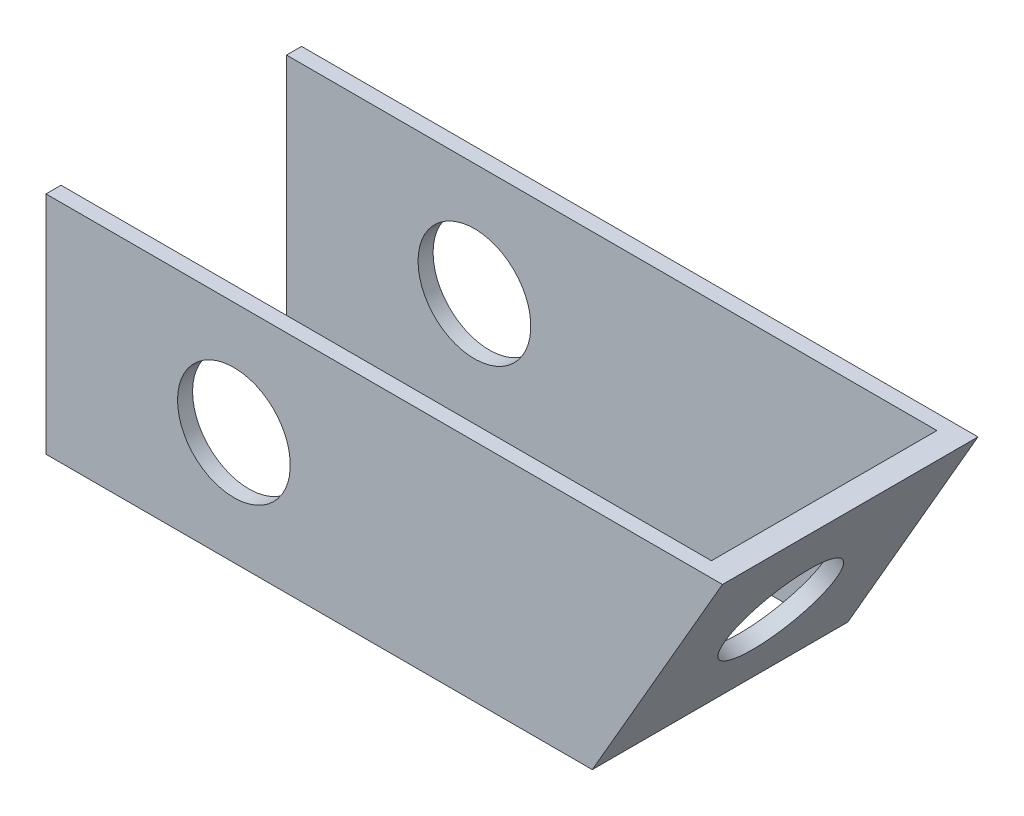
ISO-10303-21;
HEADER;
FILE_DESCRIPTION(('STEP AP214'),'2;1');
FILE_NAME('part.step','',(''),(''),'','','');
FILE_SCHEMA(('AUTOMOTIVE_DESIGN { 1 0 10303 214 1 1 1 1 }'));
ENDSEC;
DATA;
#1=APPLICATION_CONTEXT('core data for automotive mechanical design processes');
#2=APPLICATION_PROTOCOL_DEFINITION('international standard','automotive_design',2000,#1);
#3=PRODUCT_CONTEXT('',#1,'mechanical');
#4=PRODUCT('Part','Part','',(#3));
#5=PRODUCT_RELATED_PRODUCT_CATEGORY('part','',(#4));
#6=PRODUCT_DEFINITION_FORMATION('','',#4);
#7=PRODUCT_DEFINITION_CONTEXT('part definition',#1,'design');
#8=PRODUCT_DEFINITION('design','',#6,#7);
#9=PRODUCT_DEFINITION_SHAPE('','',#8);
#10=(LENGTH_UNIT() NAMED_UNIT(*) SI_UNIT(.MILLI.,.METRE.));
#11=(NAMED_UNIT(*) PLANE_ANGLE_UNIT() SI_UNIT($,.RADIAN.));
#12=(NAMED_UNIT(*) SI_UNIT($,.STERADIAN.) SOLID_ANGLE_UNIT());
#13=UNCERTAINTY_MEASURE_WITH_UNIT(LENGTH_MEASURE(1.E-05),#10,'distance_accuracy_value','');
#14=(GEOMETRIC_REPRESENTATION_CONTEXT(3) GLOBAL_UNCERTAINTY_ASSIGNED_CONTEXT((#13)) GLOBAL_UNIT_ASSIGNED_CONTEXT((#10,
#11,#12)) REPRESENTATION_CONTEXT('',''));
#15=CARTESIAN_POINT('',(0.,0.,0.));
#16=DIRECTION('',(0.,0.,1.));
#17=DIRECTION('',(1.,0.,0.));
#18=AXIS2_PLACEMENT_3D('',#15,#16,#17);
#19=CARTESIAN_POINT('',(-45.,0.,34.));
#20=DIRECTION('',(-1.,0.,0.));
#21=DIRECTION('',(0.,0.,1.));
#22=AXIS2_PLACEMENT_3D('',#19,#20,#21);
#23=PLANE('',#22);
#24=DIRECTION('',(0.,0.,-1.));
#25=VECTOR('',#24,1.);
#26=CARTESIAN_POINT('',(-45.,15.,34.));
#27=LINE('',#26,#25);
#28=CARTESIAN_POINT('',(-45.,15.,34.));
#29=VERTEX_POINT('',#28);
#30=CARTESIAN_POINT('',(-45.,15.,32.));
#31=VERTEX_POINT('',#30);
#32=EDGE_CURVE('E241',#29,#31,#27,.T.);
#33=ORIENTED_EDGE('',*,*,#32,.T.);
#34=DIRECTION('',(0.,1.,0.));
#35=VECTOR('',#34,1.);
#36=CARTESIAN_POINT('',(-45.,0.,32.));
#37=LINE('',#36,#35);
#38=CARTESIAN_POINT('',(-45.,-15.,32.));
#39=VERTEX_POINT('',#38);
#40=EDGE_CURVE('E202',#39,#31,#37,.T.);
#41=ORIENTED_EDGE('',*,*,#40,.F.);
#42=DIRECTION('',(0.,0.,-1.));
#43=VECTOR('',#42,1.);
#44=CARTESIAN_POINT('',(-45.,-15.,34.));
#45=LINE('',#44,#43);
#46=CARTESIAN_POINT('',(-45.,-15.,34.));
#47=VERTEX_POINT('',#46);
#48=EDGE_CURVE('E11',#47,#39,#45,.T.);
#49=ORIENTED_EDGE('',*,*,#48,.F.);
#50=DIRECTION('',(0.,1.,0.));
#51=VECTOR('',#50,1.);
#52=CARTESIAN_POINT('',(-45.,0.,34.));
#53=LINE('',#52,#51);
#54=EDGE_CURVE('E214',#47,#29,#53,.T.);
#55=ORIENTED_EDGE('',*,*,#54,.T.);
#56=EDGE_LOOP('',(#33,#41,#49,#55));
#57=FACE_BOUND('',#56,.T.);
#58=ADVANCED_FACE('F40',(#57),#23,.T.);
#59=CARTESIAN_POINT('',(0.,-15.,34.));
#60=DIRECTION('',(0.,-1.,0.));
#61=DIRECTION('',(1.,0.,0.));
#62=AXIS2_PLACEMENT_3D('',#59,#60,#61);
#63=PLANE('',#62);
#64=DIRECTION('',(1.,0.,0.));
#65=VECTOR('',#64,1.);
#66=CARTESIAN_POINT('',(0.,-15.,32.));
#67=LINE('',#66,#65);
#68=CARTESIAN_POINT('',(26.5247913859321,-15.,32.));
#69=VERTEX_POINT('',#68);
#70=EDGE_CURVE('E138',#39,#69,#67,.T.);
#71=ORIENTED_EDGE('',*,*,#70,.T.);
#72=DIRECTION('',(0.,0.,-1.));
#73=VECTOR('',#72,1.);
#74=CARTESIAN_POINT('',(26.5247913859321,-15.,32.));
#75=LINE('',#74,#73);
#76=CARTESIAN_POINT('',(26.5247913859321,-15.,2.));
#77=VERTEX_POINT('',#76);
#78=EDGE_CURVE('E144',#69,#77,#75,.T.);
#79=ORIENTED_EDGE('',*,*,#78,.T.);
#80=DIRECTION('',(1.,0.,0.));
#81=VECTOR('',#80,1.);
#82=CARTESIAN_POINT('',(0.,-15.,2.));
#83=LINE('',#82,#81);
#84=CARTESIAN_POINT('',(-45.,-15.,2.));
#85=VERTEX_POINT('',#84);
#86=EDGE_CURVE('E126',#85,#77,#83,.T.);
#87=ORIENTED_EDGE('',*,*,#86,.F.);
#88=CARTESIAN_POINT('',(-45.,-15.,0.));
#89=VERTEX_POINT('',#88);
#90=EDGE_CURVE('E51',#85,#89,#45,.T.);
#91=ORIENTED_EDGE('',*,*,#90,.T.);
#92=DIRECTION('',(-1.,0.,0.));
#93=VECTOR('',#92,1.);
#94=CARTESIAN_POINT('',(0.,-15.,0.));
#95=LINE('',#94,#93);
#96=CARTESIAN_POINT('',(27.6794919243113,-15.,0.));
#97=VERTEX_POINT('',#96);
#98=EDGE_CURVE('E231',#97,#89,#95,.T.);
#99=ORIENTED_EDGE('',*,*,#98,.F.);
#100=DIRECTION('',(0.,0.,-1.));
#101=VECTOR('',#100,1.);
#102=CARTESIAN_POINT('',(27.6794919243113,-15.,34.));
#103=LINE('',#102,#101);
#104=CARTESIAN_POINT('',(27.6794919243113,-15.,34.));
#105=VERTEX_POINT('',#104);
#106=EDGE_CURVE('E247',#105,#97,#103,.T.);
#107=ORIENTED_EDGE('',*,*,#106,.F.);
#108=DIRECTION('',(-1.,0.,0.));
#109=VECTOR('',#108,1.);
#110=CARTESIAN_POINT('',(0.,-15.,34.));
#111=LINE('',#110,#109);
#112=EDGE_CURVE('E217',#105,#47,#111,.T.);
#113=ORIENTED_EDGE('',*,*,#112,.T.);
#114=ORIENTED_EDGE('',*,*,#48,.T.);
#115=EDGE_LOOP('',(#71,#79,#87,#91,#99,#107,#113,#114));
#116=FACE_BOUND('',#115,.T.);
#117=ADVANCED_FACE('F151',(#116),#63,.T.);
#118=CARTESIAN_POINT('',(0.,15.,34.));
#119=DIRECTION('',(0.,-1.,0.));
#120=DIRECTION('',(1.,0.,0.));
#121=AXIS2_PLACEMENT_3D('',#118,#119,#120);
#122=PLANE('',#121);
#123=DIRECTION('',(-1.,0.,0.));
#124=VECTOR('',#123,1.);
#125=CARTESIAN_POINT('',(0.,15.,2.));
#126=LINE('',#125,#124);
#127=CARTESIAN_POINT('',(41.5358983848623,15.,2.));
#128=VERTEX_POINT('',#127);
#129=CARTESIAN_POINT('',(-45.,15.,2.));
#130=VERTEX_POINT('',#129);
#131=EDGE_CURVE('E187',#128,#130,#126,.T.);
#132=ORIENTED_EDGE('',*,*,#131,.F.);
#133=DIRECTION('',(0.,0.,1.));
#134=VECTOR('',#133,1.);
#135=CARTESIAN_POINT('',(41.5358983848623,15.,32.));
#136=LINE('',#135,#134);
#137=CARTESIAN_POINT('',(41.5358983848623,15.,32.));
#138=VERTEX_POINT('',#137);
#139=EDGE_CURVE('E164',#128,#138,#136,.T.);
#140=ORIENTED_EDGE('',*,*,#139,.T.);
#141=DIRECTION('',(-1.,0.,0.));
#142=VECTOR('',#141,1.);
#143=CARTESIAN_POINT('',(0.,15.,32.));
#144=LINE('',#143,#142);
#145=EDGE_CURVE('E139',#138,#31,#144,.T.);
#146=ORIENTED_EDGE('',*,*,#145,.T.);
#147=ORIENTED_EDGE('',*,*,#32,.F.);
#148=DIRECTION('',(-1.,0.,0.));
#149=VECTOR('',#148,1.);
#150=CARTESIAN_POINT('',(0.,15.,34.));
#151=LINE('',#150,#149);
#152=CARTESIAN_POINT('',(45.,15.,34.));
#153=VERTEX_POINT('',#152);
#154=EDGE_CURVE('E59',#153,#29,#151,.T.);
#155=ORIENTED_EDGE('',*,*,#154,.F.);
#156=DIRECTION('',(0.,0.,-1.));
#157=VECTOR('',#156,1.);
#158=CARTESIAN_POINT('',(45.,15.,34.));
#159=LINE('',#158,#157);
#160=CARTESIAN_POINT('',(45.,15.,0.));
#161=VERTEX_POINT('',#160);
#162=EDGE_CURVE('E76',#153,#161,#159,.T.);
#163=ORIENTED_EDGE('',*,*,#162,.T.);
#164=DIRECTION('',(-1.,0.,0.));
#165=VECTOR('',#164,1.);
#166=CARTESIAN_POINT('',(0.,15.,0.));
#167=LINE('',#166,#165);
#168=CARTESIAN_POINT('',(-45.,15.,0.));
#169=VERTEX_POINT('',#168);
#170=EDGE_CURVE('E218',#161,#169,#167,.T.);
#171=ORIENTED_EDGE('',*,*,#170,.T.);
#172=EDGE_CURVE('E84',#130,#169,#27,.T.);
#173=ORIENTED_EDGE('',*,*,#172,.F.);
#174=EDGE_LOOP('',(#132,#140,#146,#147,#155,#163,#171,#173));
#175=FACE_BOUND('',#174,.T.);
#176=ADVANCED_FACE('F256',(#175),#122,.F.);
#177=DIRECTION('',(0.,1.,0.));
#178=VECTOR('',#177,1.);
#179=CARTESIAN_POINT('',(-45.,0.,2.));
#180=LINE('',#179,#178);
#181=EDGE_CURVE('E133',#85,#130,#180,.T.);
#182=ORIENTED_EDGE('',*,*,#181,.T.);
#183=ORIENTED_EDGE('',*,*,#172,.T.);
#184=DIRECTION('',(0.,1.,0.));
#185=VECTOR('',#184,1.);
#186=CARTESIAN_POINT('',(-45.,0.,0.));
#187=LINE('',#186,#185);
#188=EDGE_CURVE('E197',#89,#169,#187,.T.);
#189=ORIENTED_EDGE('',*,*,#188,.F.);
#190=ORIENTED_EDGE('',*,*,#90,.F.);
#191=EDGE_LOOP('',(#182,#183,#189,#190));
#192=FACE_BOUND('',#191,.T.);
#193=ADVANCED_FACE('F42',(#192),#23,.T.);
#194=CARTESIAN_POINT('',(27.2548094716168,-15.7355715851498,34.));
#195=DIRECTION('',(0.86602540378444,-0.499999999999998,0.));
#196=DIRECTION('',(0.499999999999998,0.86602540378444,0.));
#197=AXIS2_PLACEMENT_3D('',#194,#195,#196);
#198=PLANE('',#197);
#199=CARTESIAN_POINT('',(35.7623956929661,-0.999999999999989,17.));
#200=DIRECTION('',(-0.86602540378444,0.499999999999998,0.));
#201=DIRECTION('',(-0.499999999999998,-0.86602540378444,0.));
#202=AXIS2_PLACEMENT_3D('',#199,#200,#201);
#203=CIRCLE('',#202,7.5);
#204=CARTESIAN_POINT('',(32.0123956929661,-7.49519052838329,17.));
#205=VERTEX_POINT('',#204);
#206=EDGE_CURVE('E155',#205,#205,#203,.T.);
#207=ORIENTED_EDGE('',*,*,#206,.T.);
#208=EDGE_LOOP('',(#207));
#209=FACE_BOUND('',#208,.T.);
#210=DIRECTION('',(-0.499999999999998,-0.86602540378444,0.));
#211=VECTOR('',#210,1.);
#212=CARTESIAN_POINT('',(27.2548094716168,-15.7355715851498,0.));
#213=LINE('',#212,#211);
#214=EDGE_CURVE('E235',#161,#97,#213,.T.);
#215=ORIENTED_EDGE('',*,*,#214,.F.);
#216=ORIENTED_EDGE('',*,*,#162,.F.);
#217=DIRECTION('',(-0.499999999999998,-0.86602540378444,0.));
#218=VECTOR('',#217,1.);
#219=CARTESIAN_POINT('',(27.2548094716168,-15.7355715851498,34.));
#220=LINE('',#219,#218);
#221=EDGE_CURVE('E222',#153,#105,#220,.T.);
#222=ORIENTED_EDGE('',*,*,#221,.T.);
#223=ORIENTED_EDGE('',*,*,#106,.T.);
#224=EDGE_LOOP('',(#215,#216,#222,#223));
#225=FACE_BOUND('',#224,.T.);
#226=ADVANCED_FACE('F255',(#209,#225),#198,.T.);
#227=CARTESIAN_POINT('',(0.,0.,34.));
#228=DIRECTION('',(0.,0.,1.));
#229=DIRECTION('',(1.,0.,0.));
#230=AXIS2_PLACEMENT_3D('',#227,#228,#229);
#231=PLANE('',#230);
#232=CARTESIAN_POINT('',(-20.,0.,34.));
#233=DIRECTION('',(0.,0.,1.));
#234=DIRECTION('',(1.,0.,0.));
#235=AXIS2_PLACEMENT_3D('',#232,#233,#234);
#236=CIRCLE('',#235,7.5);
#237=CARTESIAN_POINT('',(-27.5,0.,34.));
#238=VERTEX_POINT('',#237);
#239=EDGE_CURVE('E183',#238,#238,#236,.T.);
#240=ORIENTED_EDGE('',*,*,#239,.F.);
#241=EDGE_LOOP('',(#240));
#242=FACE_BOUND('',#241,.T.);
#243=ORIENTED_EDGE('',*,*,#54,.F.);
#244=ORIENTED_EDGE('',*,*,#112,.F.);
#245=ORIENTED_EDGE('',*,*,#221,.F.);
#246=ORIENTED_EDGE('',*,*,#154,.T.);
#247=EDGE_LOOP('',(#243,#244,#245,#246));
#248=FACE_BOUND('',#247,.T.);
#249=ADVANCED_FACE('F258',(#242,#248),#231,.T.);
#250=CARTESIAN_POINT('',(0.,0.,0.));
#251=DIRECTION('',(0.,0.,1.));
#252=DIRECTION('',(1.,0.,0.));
#253=AXIS2_PLACEMENT_3D('',#250,#251,#252);
#254=PLANE('',#253);
#255=CARTESIAN_POINT('',(-20.,0.,0.));
#256=DIRECTION('',(0.,0.,-1.));
#257=DIRECTION('',(-1.,0.,0.));
#258=AXIS2_PLACEMENT_3D('',#255,#256,#257);
#259=CIRCLE('',#258,7.5);
#260=CARTESIAN_POINT('',(-27.5,0.,0.));
#261=VERTEX_POINT('',#260);
#262=EDGE_CURVE('E173',#261,#261,#259,.T.);
#263=ORIENTED_EDGE('',*,*,#262,.F.);
#264=EDGE_LOOP('',(#263));
#265=FACE_BOUND('',#264,.T.);
#266=ORIENTED_EDGE('',*,*,#188,.T.);
#267=ORIENTED_EDGE('',*,*,#170,.F.);
#268=ORIENTED_EDGE('',*,*,#214,.T.);
#269=ORIENTED_EDGE('',*,*,#98,.T.);
#270=EDGE_LOOP('',(#266,#267,#268,#269));
#271=FACE_BOUND('',#270,.T.);
#272=ADVANCED_FACE('F254',(#265,#271),#254,.F.);
#273=CARTESIAN_POINT('',(25.522758664048,-14.7355715851499,34.));
#274=DIRECTION('',(0.86602540378444,-0.499999999999998,0.));
#275=DIRECTION('',(0.499999999999998,0.86602540378444,0.));
#276=AXIS2_PLACEMENT_3D('',#273,#274,#275);
#277=PLANE('',#276);
#278=CARTESIAN_POINT('',(34.0303448853972,0.,17.));
#279=DIRECTION('',(-0.86602540378444,0.499999999999998,0.));
#280=DIRECTION('',(-0.499999999999998,-0.86602540378444,0.));
#281=AXIS2_PLACEMENT_3D('',#278,#279,#280);
#282=CIRCLE('',#281,7.5);
#283=CARTESIAN_POINT('',(30.2803448853972,-6.49519052838329,17.));
#284=VERTEX_POINT('',#283);
#285=EDGE_CURVE('E159',#284,#284,#282,.T.);
#286=ORIENTED_EDGE('',*,*,#285,.F.);
#287=EDGE_LOOP('',(#286));
#288=FACE_BOUND('',#287,.T.);
#289=DIRECTION('',(-0.499999999999998,-0.86602540378444,0.));
#290=VECTOR('',#289,1.);
#291=CARTESIAN_POINT('',(25.522758664048,-14.7355715851499,2.));
#292=LINE('',#291,#290);
#293=CARTESIAN_POINT('',(41.5358983848623,13.,2.));
#294=VERTEX_POINT('',#293);
#295=CARTESIAN_POINT('',(26.5247913859321,-13.,2.));
#296=VERTEX_POINT('',#295);
#297=EDGE_CURVE('E199',#294,#296,#292,.T.);
#298=ORIENTED_EDGE('',*,*,#297,.T.);
#299=DIRECTION('',(0.,0.,-1.));
#300=VECTOR('',#299,1.);
#301=CARTESIAN_POINT('',(26.5247913859321,-13.,34.));
#302=LINE('',#301,#300);
#303=CARTESIAN_POINT('',(26.5247913859321,-13.,32.));
#304=VERTEX_POINT('',#303);
#305=EDGE_CURVE('E146',#304,#296,#302,.T.);
#306=ORIENTED_EDGE('',*,*,#305,.F.);
#307=DIRECTION('',(-0.499999999999998,-0.86602540378444,0.));
#308=VECTOR('',#307,1.);
#309=CARTESIAN_POINT('',(25.522758664048,-14.7355715851499,32.));
#310=LINE('',#309,#308);
#311=CARTESIAN_POINT('',(41.5358983848623,13.,32.));
#312=VERTEX_POINT('',#311);
#313=EDGE_CURVE('E206',#312,#304,#310,.T.);
#314=ORIENTED_EDGE('',*,*,#313,.F.);
#315=DIRECTION('',(0.,0.,-1.));
#316=VECTOR('',#315,1.);
#317=CARTESIAN_POINT('',(41.5358983848623,13.,34.));
#318=LINE('',#317,#316);
#319=EDGE_CURVE('E198',#312,#294,#318,.T.);
#320=ORIENTED_EDGE('',*,*,#319,.T.);
#321=EDGE_LOOP('',(#298,#306,#314,#320));
#322=FACE_BOUND('',#321,.T.);
#323=ADVANCED_FACE('F263',(#288,#322),#277,.F.);
#324=CARTESIAN_POINT('',(0.,0.,32.));
#325=DIRECTION('',(0.,0.,1.));
#326=DIRECTION('',(1.,0.,0.));
#327=AXIS2_PLACEMENT_3D('',#324,#325,#326);
#328=PLANE('',#327);
#329=CARTESIAN_POINT('',(-20.,0.,32.));
#330=DIRECTION('',(0.,0.,1.));
#331=DIRECTION('',(1.,0.,0.));
#332=AXIS2_PLACEMENT_3D('',#329,#330,#331);
#333=CIRCLE('',#332,7.5);
#334=CARTESIAN_POINT('',(-27.5,0.,32.));
#335=VERTEX_POINT('',#334);
#336=EDGE_CURVE('E179',#335,#335,#333,.T.);
#337=ORIENTED_EDGE('',*,*,#336,.T.);
#338=EDGE_LOOP('',(#337));
#339=FACE_BOUND('',#338,.T.);
#340=ORIENTED_EDGE('',*,*,#313,.T.);
#341=DIRECTION('',(0.,1.,0.));
#342=VECTOR('',#341,1.);
#343=CARTESIAN_POINT('',(26.5247913859321,-15.,32.));
#344=LINE('',#343,#342);
#345=EDGE_CURVE('E149',#69,#304,#344,.T.);
#346=ORIENTED_EDGE('',*,*,#345,.F.);
#347=ORIENTED_EDGE('',*,*,#70,.F.);
#348=ORIENTED_EDGE('',*,*,#40,.T.);
#349=ORIENTED_EDGE('',*,*,#145,.F.);
#350=DIRECTION('',(0.,-1.,0.));
#351=VECTOR('',#350,1.);
#352=CARTESIAN_POINT('',(41.5358983848623,15.,32.));
#353=LINE('',#352,#351);
#354=EDGE_CURVE('E169',#138,#312,#353,.T.);
#355=ORIENTED_EDGE('',*,*,#354,.T.);
#356=EDGE_LOOP('',(#340,#346,#347,#348,#349,#355));
#357=FACE_BOUND('',#356,.T.);
#358=ADVANCED_FACE('F260',(#339,#357),#328,.F.);
#359=CARTESIAN_POINT('',(0.,0.,2.));
#360=DIRECTION('',(0.,0.,1.));
#361=DIRECTION('',(1.,0.,0.));
#362=AXIS2_PLACEMENT_3D('',#359,#360,#361);
#363=PLANE('',#362);
#364=CARTESIAN_POINT('',(-20.,0.,2.));
#365=DIRECTION('',(0.,0.,1.));
#366=DIRECTION('',(1.,0.,0.));
#367=AXIS2_PLACEMENT_3D('',#364,#365,#366);
#368=CIRCLE('',#367,7.5);
#369=CARTESIAN_POINT('',(-27.5,0.,2.));
#370=VERTEX_POINT('',#369);
#371=EDGE_CURVE('E44',#370,#370,#368,.T.);
#372=ORIENTED_EDGE('',*,*,#371,.F.);
#373=EDGE_LOOP('',(#372));
#374=FACE_BOUND('',#373,.T.);
#375=ORIENTED_EDGE('',*,*,#297,.F.);
#376=DIRECTION('',(0.,-1.,0.));
#377=VECTOR('',#376,1.);
#378=CARTESIAN_POINT('',(41.5358983848623,15.,2.));
#379=LINE('',#378,#377);
#380=EDGE_CURVE('E170',#128,#294,#379,.T.);
#381=ORIENTED_EDGE('',*,*,#380,.F.);
#382=ORIENTED_EDGE('',*,*,#131,.T.);
#383=ORIENTED_EDGE('',*,*,#181,.F.);
#384=ORIENTED_EDGE('',*,*,#86,.T.);
#385=DIRECTION('',(0.,1.,0.));
#386=VECTOR('',#385,1.);
#387=CARTESIAN_POINT('',(26.5247913859321,-15.,2.));
#388=LINE('',#387,#386);
#389=EDGE_CURVE('E130',#77,#296,#388,.T.);
#390=ORIENTED_EDGE('',*,*,#389,.T.);
#391=EDGE_LOOP('',(#375,#381,#382,#383,#384,#390));
#392=FACE_BOUND('',#391,.T.);
#393=ADVANCED_FACE('F129',(#374,#392),#363,.T.);
#394=CARTESIAN_POINT('',(-20.,0.,50.));
#395=DIRECTION('',(0.,0.,-1.));
#396=DIRECTION('',(-1.,0.,0.));
#397=AXIS2_PLACEMENT_3D('',#394,#395,#396);
#398=CYLINDRICAL_SURFACE('',#397,7.5);
#399=CARTESIAN_POINT('',(-27.5,0.,2.));
#400=CARTESIAN_POINT('',(-27.5,0.,1.97916666666667));
#401=CARTESIAN_POINT('',(-27.5,0.,1.95833333333334));
#402=CARTESIAN_POINT('',(-27.5,0.,1.91666666666667));
#403=CARTESIAN_POINT('',(-27.5,0.,1.89583333333334));
#404=CARTESIAN_POINT('',(-27.5,0.,1.85416666666667));
#405=CARTESIAN_POINT('',(-27.5,0.,1.83333333333334));
#406=CARTESIAN_POINT('',(-27.5,0.,1.79166666666667));
#407=CARTESIAN_POINT('',(-27.5,0.,1.77083333333334));
#408=CARTESIAN_POINT('',(-27.5,0.,1.72916666666667));
#409=CARTESIAN_POINT('',(-27.5,0.,1.70833333333333));
#410=CARTESIAN_POINT('',(-27.5,0.,1.66666666666667));
#411=CARTESIAN_POINT('',(-27.5,0.,1.64583333333333));
#412=CARTESIAN_POINT('',(-27.5,0.,1.60416666666667));
#413=CARTESIAN_POINT('',(-27.5,0.,1.58333333333333));
#414=CARTESIAN_POINT('',(-27.5,0.,1.54166666666667));
#415=CARTESIAN_POINT('',(-27.5,0.,1.52083333333333));
#416=CARTESIAN_POINT('',(-27.5,0.,1.47916666666667));
#417=CARTESIAN_POINT('',(-27.5,0.,1.45833333333333));
#418=CARTESIAN_POINT('',(-27.5,0.,1.41666666666667));
#419=CARTESIAN_POINT('',(-27.5,0.,1.39583333333333));
#420=CARTESIAN_POINT('',(-27.5,0.,1.35416666666667));
#421=CARTESIAN_POINT('',(-27.5,0.,1.33333333333333));
#422=CARTESIAN_POINT('',(-27.5,0.,1.29166666666667));
#423=CARTESIAN_POINT('',(-27.5,0.,1.27083333333333));
#424=CARTESIAN_POINT('',(-27.5,0.,1.22916666666667));
#425=CARTESIAN_POINT('',(-27.5,0.,1.20833333333333));
#426=CARTESIAN_POINT('',(-27.5,0.,1.16666666666667));
#427=CARTESIAN_POINT('',(-27.5,0.,1.14583333333333));
#428=CARTESIAN_POINT('',(-27.5,0.,1.10416666666667));
#429=CARTESIAN_POINT('',(-27.5,0.,1.08333333333333));
#430=CARTESIAN_POINT('',(-27.5,0.,1.04166666666667));
#431=CARTESIAN_POINT('',(-27.5,0.,1.02083333333333));
#432=CARTESIAN_POINT('',(-27.5,0.,0.979166666666668));
#433=CARTESIAN_POINT('',(-27.5,0.,0.958333333333334));
#434=CARTESIAN_POINT('',(-27.5,0.,0.916666666666668));
#435=CARTESIAN_POINT('',(-27.5,0.,0.895833333333334));
#436=CARTESIAN_POINT('',(-27.5,0.,0.854166666666667));
#437=CARTESIAN_POINT('',(-27.5,0.,0.833333333333334));
#438=CARTESIAN_POINT('',(-27.5,0.,0.791666666666667));
#439=CARTESIAN_POINT('',(-27.5,0.,0.770833333333334));
#440=CARTESIAN_POINT('',(-27.5,0.,0.729166666666667));
#441=CARTESIAN_POINT('',(-27.5,0.,0.708333333333334));
#442=CARTESIAN_POINT('',(-27.5,0.,0.666666666666667));
#443=CARTESIAN_POINT('',(-27.5,0.,0.645833333333334));
#444=CARTESIAN_POINT('',(-27.5,0.,0.604166666666667));
#445=CARTESIAN_POINT('',(-27.5,0.,0.583333333333334));
#446=CARTESIAN_POINT('',(-27.5,0.,0.541666666666667));
#447=CARTESIAN_POINT('',(-27.5,0.,0.520833333333334));
#448=CARTESIAN_POINT('',(-27.5,0.,0.479166666666667));
#449=CARTESIAN_POINT('',(-27.5,0.,0.458333333333334));
#450=CARTESIAN_POINT('',(-27.5,0.,0.416666666666667));
#451=CARTESIAN_POINT('',(-27.5,0.,0.395833333333334));
#452=CARTESIAN_POINT('',(-27.5,0.,0.354166666666667));
#453=CARTESIAN_POINT('',(-27.5,0.,0.333333333333334));
#454=CARTESIAN_POINT('',(-27.5,0.,0.291666666666667));
#455=CARTESIAN_POINT('',(-27.5,0.,0.270833333333334));
#456=CARTESIAN_POINT('',(-27.5,0.,0.229166666666667));
#457=CARTESIAN_POINT('',(-27.5,0.,0.208333333333334));
#458=CARTESIAN_POINT('',(-27.5,0.,0.166666666666667));
#459=CARTESIAN_POINT('',(-27.5,0.,0.145833333333333));
#460=CARTESIAN_POINT('',(-27.5,0.,0.104166666666667));
#461=CARTESIAN_POINT('',(-27.5,0.,0.0833333333333334));
#462=CARTESIAN_POINT('',(-27.5,0.,0.0416666666666667));
#463=CARTESIAN_POINT('',(-27.5,0.,0.0208333333333333));
#464=CARTESIAN_POINT('',(-27.5,0.,0.));
#465=B_SPLINE_CURVE_WITH_KNOTS('',3,(#399,#400,#401,#402,#403,#404,#405,#406,#407,#408,#409,
#410,#411,#412,#413,#414,#415,#416,#417,#418,#419,#420,#421,#422,#423,#424,#425,#426,#427,#428,
#429,#430,#431,#432,#433,#434,#435,#436,#437,#438,#439,#440,#441,#442,#443,#444,#445,#446,#447,
#448,#449,#450,#451,#452,#453,#454,#455,#456,#457,#458,#459,#460,#461,#462,#463,#464),
.UNSPECIFIED.,.F.,.F.,(4,2,2,2,2,2,2,2,2,2,2,2,2,2,2,2,2,2,2,2,2,2,2,2,2,2,2,2,2,2,2,2,4),(0.,
0.0625000000000001,0.125,0.1875,0.25,0.3125,0.375,0.4375,0.5,0.5625,0.625000000000001,
0.687500000000001,0.750000000000001,0.812500000000001,0.875000000000001,0.937500000000001,1.,
1.0625,1.125,1.1875,1.25,1.3125,1.375,1.4375,1.5,1.5625,1.625,1.6875,1.75,1.8125,1.875,1.9375,
2.),.UNSPECIFIED.);
#466=EDGE_CURVE('BSEAM275',#370,#261,#465,.T.);
#467=ORIENTED_EDGE('',*,*,#371,.T.);
#468=ORIENTED_EDGE('',*,*,#262,.T.);
#469=ORIENTED_EDGE('',*,*,#466,.T.);
#470=ORIENTED_EDGE('',*,*,#466,.F.);
#471=EDGE_LOOP('',(#467,#469,#468,#470));
#472=FACE_BOUND('',#471,.T.);
#473=ADVANCED_FACE('F275',(#472),#398,.F.);
#474=CARTESIAN_POINT('',(-27.5,0.,34.));
#475=CARTESIAN_POINT('',(-27.5,0.,33.9791666666667));
#476=CARTESIAN_POINT('',(-27.5,0.,33.9583333333333));
#477=CARTESIAN_POINT('',(-27.5,0.,33.9166666666667));
#478=CARTESIAN_POINT('',(-27.5,0.,33.8958333333333));
#479=CARTESIAN_POINT('',(-27.5,0.,33.8541666666667));
#480=CARTESIAN_POINT('',(-27.5,0.,33.8333333333333));
#481=CARTESIAN_POINT('',(-27.5,0.,33.7916666666667));
#482=CARTESIAN_POINT('',(-27.5,0.,33.7708333333333));
#483=CARTESIAN_POINT('',(-27.5,0.,33.7291666666667));
#484=CARTESIAN_POINT('',(-27.5,0.,33.7083333333333));
#485=CARTESIAN_POINT('',(-27.5,0.,33.6666666666667));
#486=CARTESIAN_POINT('',(-27.5,0.,33.6458333333333));
#487=CARTESIAN_POINT('',(-27.5,0.,33.6041666666667));
#488=CARTESIAN_POINT('',(-27.5,0.,33.5833333333333));
#489=CARTESIAN_POINT('',(-27.5,0.,33.5416666666667));
#490=CARTESIAN_POINT('',(-27.5,0.,33.5208333333333));
#491=CARTESIAN_POINT('',(-27.5,0.,33.4791666666667));
#492=CARTESIAN_POINT('',(-27.5,0.,33.4583333333333));
#493=CARTESIAN_POINT('',(-27.5,0.,33.4166666666667));
#494=CARTESIAN_POINT('',(-27.5,0.,33.3958333333333));
#495=CARTESIAN_POINT('',(-27.5,0.,33.3541666666667));
#496=CARTESIAN_POINT('',(-27.5,0.,33.3333333333333));
#497=CARTESIAN_POINT('',(-27.5,0.,33.2916666666667));
#498=CARTESIAN_POINT('',(-27.5,0.,33.2708333333333));
#499=CARTESIAN_POINT('',(-27.5,0.,33.2291666666667));
#500=CARTESIAN_POINT('',(-27.5,0.,33.2083333333333));
#501=CARTESIAN_POINT('',(-27.5,0.,33.1666666666667));
#502=CARTESIAN_POINT('',(-27.5,0.,33.1458333333333));
#503=CARTESIAN_POINT('',(-27.5,0.,33.1041666666667));
#504=CARTESIAN_POINT('',(-27.5,0.,33.0833333333333));
#505=CARTESIAN_POINT('',(-27.5,0.,33.0416666666667));
#506=CARTESIAN_POINT('',(-27.5,0.,33.0208333333333));
#507=CARTESIAN_POINT('',(-27.5,0.,32.9791666666667));
#508=CARTESIAN_POINT('',(-27.5,0.,32.9583333333333));
#509=CARTESIAN_POINT('',(-27.5,0.,32.9166666666667));
#510=CARTESIAN_POINT('',(-27.5,0.,32.8958333333333));
#511=CARTESIAN_POINT('',(-27.5,0.,32.8541666666667));
#512=CARTESIAN_POINT('',(-27.5,0.,32.8333333333333));
#513=CARTESIAN_POINT('',(-27.5,0.,32.7916666666667));
#514=CARTESIAN_POINT('',(-27.5,0.,32.7708333333333));
#515=CARTESIAN_POINT('',(-27.5,0.,32.7291666666667));
#516=CARTESIAN_POINT('',(-27.5,0.,32.7083333333333));
#517=CARTESIAN_POINT('',(-27.5,0.,32.6666666666667));
#518=CARTESIAN_POINT('',(-27.5,0.,32.6458333333333));
#519=CARTESIAN_POINT('',(-27.5,0.,32.6041666666667));
#520=CARTESIAN_POINT('',(-27.5,0.,32.5833333333333));
#521=CARTESIAN_POINT('',(-27.5,0.,32.5416666666667));
#522=CARTESIAN_POINT('',(-27.5,0.,32.5208333333333));
#523=CARTESIAN_POINT('',(-27.5,0.,32.4791666666667));
#524=CARTESIAN_POINT('',(-27.5,0.,32.4583333333333));
#525=CARTESIAN_POINT('',(-27.5,0.,32.4166666666667));
#526=CARTESIAN_POINT('',(-27.5,0.,32.3958333333333));
#527=CARTESIAN_POINT('',(-27.5,0.,32.3541666666667));
#528=CARTESIAN_POINT('',(-27.5,0.,32.3333333333333));
#529=CARTESIAN_POINT('',(-27.5,0.,32.2916666666667));
#530=CARTESIAN_POINT('',(-27.5,0.,32.2708333333333));
#531=CARTESIAN_POINT('',(-27.5,0.,32.2291666666667));
#532=CARTESIAN_POINT('',(-27.5,0.,32.2083333333333));
#533=CARTESIAN_POINT('',(-27.5,0.,32.1666666666667));
#534=CARTESIAN_POINT('',(-27.5,0.,32.1458333333333));
#535=CARTESIAN_POINT('',(-27.5,0.,32.1041666666667));
#536=CARTESIAN_POINT('',(-27.5,0.,32.0833333333333));
#537=CARTESIAN_POINT('',(-27.5,0.,32.0416666666667));
#538=CARTESIAN_POINT('',(-27.5,0.,32.0208333333333));
#539=CARTESIAN_POINT('',(-27.5,0.,32.));
#540=B_SPLINE_CURVE_WITH_KNOTS('',3,(#474,#475,#476,#477,#478,#479,#480,#481,#482,#483,#484,
#485,#486,#487,#488,#489,#490,#491,#492,#493,#494,#495,#496,#497,#498,#499,#500,#501,#502,#503,
#504,#505,#506,#507,#508,#509,#510,#511,#512,#513,#514,#515,#516,#517,#518,#519,#520,#521,#522,
#523,#524,#525,#526,#527,#528,#529,#530,#531,#532,#533,#534,#535,#536,#537,#538,#539),
.UNSPECIFIED.,.F.,.F.,(4,2,2,2,2,2,2,2,2,2,2,2,2,2,2,2,2,2,2,2,2,2,2,2,2,2,2,2,2,2,2,2,4),(0.,
0.062500000000007,0.125,0.187500000000007,0.25,0.312500000000007,0.375,0.437500000000007,0.5,
0.562500000000007,0.625000000000001,0.687500000000008,0.750000000000001,0.812500000000008,
0.875000000000001,0.937500000000008,1.,1.06250000000001,1.125,1.18750000000001,1.25,
1.31250000000001,1.375,1.43750000000001,1.5,1.56250000000001,1.625,1.68750000000001,1.75,
1.81250000000001,1.875,1.93750000000001,2.),.UNSPECIFIED.);
#541=EDGE_CURVE('BSEAM284',#238,#335,#540,.T.);
#542=ORIENTED_EDGE('',*,*,#239,.T.);
#543=ORIENTED_EDGE('',*,*,#336,.F.);
#544=ORIENTED_EDGE('',*,*,#541,.T.);
#545=ORIENTED_EDGE('',*,*,#541,.F.);
#546=EDGE_LOOP('',(#542,#544,#543,#545));
#547=FACE_BOUND('',#546,.T.);
#548=ADVANCED_FACE('F284',(#547),#398,.F.);
#549=CARTESIAN_POINT('',(41.5358983848623,15.,32.));
#550=DIRECTION('',(1.,0.,0.));
#551=DIRECTION('',(0.,1.,0.));
#552=AXIS2_PLACEMENT_3D('',#549,#550,#551);
#553=PLANE('',#552);
#554=ORIENTED_EDGE('',*,*,#319,.F.);
#555=ORIENTED_EDGE('',*,*,#354,.F.);
#556=ORIENTED_EDGE('',*,*,#139,.F.);
#557=ORIENTED_EDGE('',*,*,#380,.T.);
#558=EDGE_LOOP('',(#554,#555,#556,#557));
#559=FACE_BOUND('',#558,.T.);
#560=ADVANCED_FACE('F269',(#559),#553,.F.);
#561=CARTESIAN_POINT('',(26.5247913859321,-15.,32.));
#562=DIRECTION('',(1.,0.,0.));
#563=DIRECTION('',(0.,1.,0.));
#564=AXIS2_PLACEMENT_3D('',#561,#562,#563);
#565=PLANE('',#564);
#566=ORIENTED_EDGE('',*,*,#305,.T.);
#567=ORIENTED_EDGE('',*,*,#389,.F.);
#568=ORIENTED_EDGE('',*,*,#78,.F.);
#569=ORIENTED_EDGE('',*,*,#345,.T.);
#570=EDGE_LOOP('',(#566,#567,#568,#569));
#571=FACE_BOUND('',#570,.T.);
#572=ADVANCED_FACE('F143',(#571),#565,.F.);
#573=CARTESIAN_POINT('',(35.7623956929661,-0.999999999999989,17.));
#574=DIRECTION('',(-0.86602540378444,0.499999999999998,0.));
#575=DIRECTION('',(-0.499999999999998,-0.86602540378444,0.));
#576=AXIS2_PLACEMENT_3D('',#573,#574,#575);
#577=CYLINDRICAL_SURFACE('',#576,7.5);
#578=CARTESIAN_POINT('',(32.0123956929661,-7.49519052838329,17.));
#579=CARTESIAN_POINT('',(31.9943534970539,-7.48477386171662,17.));
#580=CARTESIAN_POINT('',(31.9763113011417,-7.47435719504996,17.));
#581=CARTESIAN_POINT('',(31.9402269093174,-7.45352386171662,17.));
#582=CARTESIAN_POINT('',(31.9221847134052,-7.44310719504996,17.));
#583=CARTESIAN_POINT('',(31.8861003215808,-7.42227386171662,17.));
#584=CARTESIAN_POINT('',(31.8680581256687,-7.41185719504996,17.));
#585=CARTESIAN_POINT('',(31.8319737338443,-7.39102386171662,17.));
#586=CARTESIAN_POINT('',(31.8139315379321,-7.38060719504996,17.));
#587=CARTESIAN_POINT('',(31.7778471461078,-7.35977386171662,17.));
#588=CARTESIAN_POINT('',(31.7598049501956,-7.34935719504996,17.));
#589=CARTESIAN_POINT('',(31.7237205583713,-7.32852386171662,17.));
#590=CARTESIAN_POINT('',(31.7056783624591,-7.31810719504996,17.));
#591=CARTESIAN_POINT('',(31.6695939706347,-7.29727386171662,17.));
#592=CARTESIAN_POINT('',(31.6515517747226,-7.28685719504996,17.));
#593=CARTESIAN_POINT('',(31.6154673828982,-7.26602386171662,17.));
#594=CARTESIAN_POINT('',(31.597425186986,-7.25560719504996,17.));
#595=CARTESIAN_POINT('',(31.5613407951617,-7.23477386171662,17.));
#596=CARTESIAN_POINT('',(31.5432985992495,-7.22435719504996,17.));
#597=CARTESIAN_POINT('',(31.5072142074252,-7.20352386171662,17.));
#598=CARTESIAN_POINT('',(31.489172011513,-7.19310719504996,17.));
#599=CARTESIAN_POINT('',(31.4530876196886,-7.17227386171662,17.));
#600=CARTESIAN_POINT('',(31.4350454237765,-7.16185719504996,17.));
#601=CARTESIAN_POINT('',(31.3989610319521,-7.14102386171662,17.));
#602=CARTESIAN_POINT('',(31.3809188360399,-7.13060719504996,17.));
#603=CARTESIAN_POINT('',(31.3448344442156,-7.10977386171662,17.));
#604=CARTESIAN_POINT('',(31.3267922483034,-7.09935719504996,17.));
#605=CARTESIAN_POINT('',(31.290707856479,-7.07852386171662,17.));
#606=CARTESIAN_POINT('',(31.2726656605669,-7.06810719504996,17.));
#607=CARTESIAN_POINT('',(31.2365812687425,-7.04727386171662,17.));
#608=CARTESIAN_POINT('',(31.2185390728303,-7.03685719504996,17.));
#609=CARTESIAN_POINT('',(31.182454681006,-7.01602386171662,17.));
#610=CARTESIAN_POINT('',(31.1644124850938,-7.00560719504996,17.));
#611=CARTESIAN_POINT('',(31.1283280932695,-6.98477386171662,17.));
#612=CARTESIAN_POINT('',(31.1102858973573,-6.97435719504996,17.));
#613=CARTESIAN_POINT('',(31.0742015055329,-6.95352386171662,17.));
#614=CARTESIAN_POINT('',(31.0561593096208,-6.94310719504996,17.));
#615=CARTESIAN_POINT('',(31.0200749177964,-6.92227386171662,17.));
#616=CARTESIAN_POINT('',(31.0020327218842,-6.91185719504996,17.));
#617=CARTESIAN_POINT('',(30.9659483300599,-6.89102386171662,17.));
#618=CARTESIAN_POINT('',(30.9479061341477,-6.88060719504996,17.));
#619=CARTESIAN_POINT('',(30.9118217423234,-6.85977386171662,17.));
#620=CARTESIAN_POINT('',(30.8937795464112,-6.84935719504996,17.));
#621=CARTESIAN_POINT('',(30.8576951545868,-6.82852386171662,17.));
#622=CARTESIAN_POINT('',(30.8396529586746,-6.81810719504996,17.));
#623=CARTESIAN_POINT('',(30.8035685668503,-6.79727386171663,17.));
#624=CARTESIAN_POINT('',(30.7855263709381,-6.78685719504996,17.));
#625=CARTESIAN_POINT('',(30.7494419791138,-6.76602386171663,17.));
#626=CARTESIAN_POINT('',(30.7313997832016,-6.75560719504996,17.));
#627=CARTESIAN_POINT('',(30.6953153913772,-6.73477386171663,17.));
#628=CARTESIAN_POINT('',(30.6772731954651,-6.72435719504996,17.));
#629=CARTESIAN_POINT('',(30.6411888036407,-6.70352386171663,17.));
#630=CARTESIAN_POINT('',(30.6231466077285,-6.69310719504996,17.));
#631=CARTESIAN_POINT('',(30.5870622159042,-6.67227386171663,17.));
#632=CARTESIAN_POINT('',(30.569020019992,-6.66185719504996,17.));
#633=CARTESIAN_POINT('',(30.5329356281677,-6.64102386171663,17.));
#634=CARTESIAN_POINT('',(30.5148934322555,-6.63060719504996,17.));
#635=CARTESIAN_POINT('',(30.4788090404311,-6.60977386171663,17.));
#636=CARTESIAN_POINT('',(30.460766844519,-6.59935719504996,17.));
#637=CARTESIAN_POINT('',(30.4246824526946,-6.57852386171663,17.));
#638=CARTESIAN_POINT('',(30.4066402567824,-6.56810719504996,17.));
#639=CARTESIAN_POINT('',(30.3705558649581,-6.54727386171663,17.));
#640=CARTESIAN_POINT('',(30.3525136690459,-6.53685719504996,17.));
#641=CARTESIAN_POINT('',(30.3164292772215,-6.51602386171663,17.));
#642=CARTESIAN_POINT('',(30.2983870813094,-6.50560719504996,17.));
#643=CARTESIAN_POINT('',(30.2803448853972,-6.49519052838329,17.));
#644=B_SPLINE_CURVE_WITH_KNOTS('',3,(#578,#579,#580,#581,#582,#583,#584,#585,#586,#587,#588,
#589,#590,#591,#592,#593,#594,#595,#596,#597,#598,#599,#600,#601,#602,#603,#604,#605,#606,#607,
#608,#609,#610,#611,#612,#613,#614,#615,#616,#617,#618,#619,#620,#621,#622,#623,#624,#625,#626,
#627,#628,#629,#630,#631,#632,#633,#634,#635,#636,#637,#638,#639,#640,#641,#642,#643),
.UNSPECIFIED.,.F.,.F.,(4,2,2,2,2,2,2,2,2,2,2,2,2,2,2,2,2,2,2,2,2,2,2,2,2,2,2,2,2,2,2,2,4),(0.,
0.0625000000000002,0.125,0.187500000000001,0.250000000000001,0.312500000000001,
0.375000000000001,0.437500000000001,0.499999999999996,0.562499999999996,0.624999999999996,
0.687499999999996,0.749999999999996,0.812499999999996,0.874999999999997,0.9375,1.,1.0625,1.125,
1.1875,1.25,1.3125,1.375,1.4375,1.5,1.5625,1.625,1.6875,1.75,1.8125,1.875,1.9375,2.),.UNSPECIFIED.);
#645=EDGE_CURVE('BSEAM331',#205,#284,#644,.T.);
#646=ORIENTED_EDGE('',*,*,#206,.F.);
#647=ORIENTED_EDGE('',*,*,#285,.T.);
#648=ORIENTED_EDGE('',*,*,#645,.T.);
#649=ORIENTED_EDGE('',*,*,#645,.F.);
#650=EDGE_LOOP('',(#646,#648,#647,#649));
#651=FACE_BOUND('',#650,.T.);
#652=ADVANCED_FACE('F331',(#651),#577,.F.);
#653=CLOSED_SHELL('',(#58,#117,#176,#193,#226,#249,#272,#323,#358,#393,#473,#548,#560,#572,#652));
#654=MANIFOLD_SOLID_BREP('B2',#653);
#655=ADVANCED_BREP_SHAPE_REPRESENTATION('',(#18,#654),#14);
#656=SHAPE_DEFINITION_REPRESENTATION(#9,#655);
ENDSEC;
END-ISO-10303-21;
